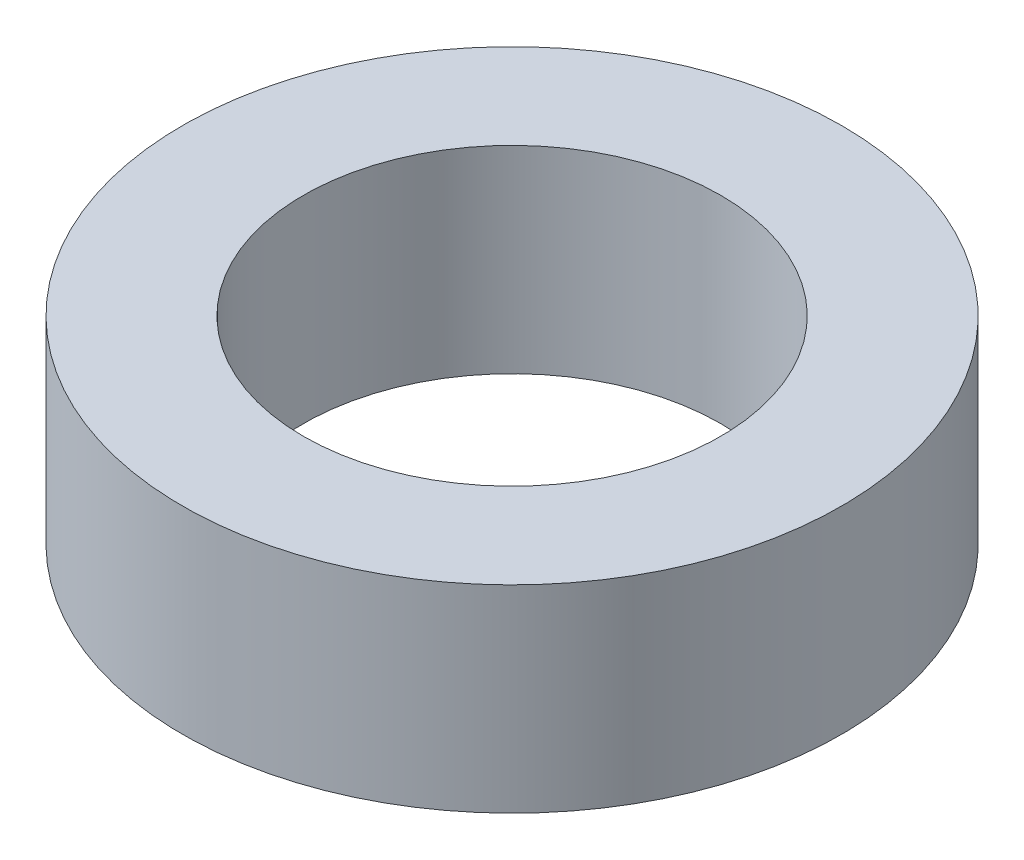
ISO-10303-21;
HEADER;
FILE_DESCRIPTION(('STEP AP214'),'2;1');
FILE_NAME('part.step','',(''),(''),'','','');
FILE_SCHEMA(('AUTOMOTIVE_DESIGN { 1 0 10303 214 1 1 1 1 }'));
ENDSEC;
DATA;
#1=APPLICATION_CONTEXT('core data for automotive mechanical design processes');
#2=APPLICATION_PROTOCOL_DEFINITION('international standard','automotive_design',2000,#1);
#3=PRODUCT_CONTEXT('',#1,'mechanical');
#4=PRODUCT('Part','Part','',(#3));
#5=PRODUCT_RELATED_PRODUCT_CATEGORY('part','',(#4));
#6=PRODUCT_DEFINITION_FORMATION('','',#4);
#7=PRODUCT_DEFINITION_CONTEXT('part definition',#1,'design');
#8=PRODUCT_DEFINITION('design','',#6,#7);
#9=PRODUCT_DEFINITION_SHAPE('','',#8);
#10=(LENGTH_UNIT() NAMED_UNIT(*) SI_UNIT(.MILLI.,.METRE.));
#11=(NAMED_UNIT(*) PLANE_ANGLE_UNIT() SI_UNIT($,.RADIAN.));
#12=(NAMED_UNIT(*) SI_UNIT($,.STERADIAN.) SOLID_ANGLE_UNIT());
#13=UNCERTAINTY_MEASURE_WITH_UNIT(LENGTH_MEASURE(1.E-05),#10,'distance_accuracy_value','');
#14=(GEOMETRIC_REPRESENTATION_CONTEXT(3) GLOBAL_UNCERTAINTY_ASSIGNED_CONTEXT((#13)) GLOBAL_UNIT_ASSIGNED_CONTEXT((#10,
#11,#12)) REPRESENTATION_CONTEXT('',''));
#15=CARTESIAN_POINT('',(0.,0.,0.));
#16=DIRECTION('',(0.,0.,1.));
#17=DIRECTION('',(1.,0.,0.));
#18=AXIS2_PLACEMENT_3D('',#15,#16,#17);
#19=CARTESIAN_POINT('',(0.,9.,0.));
#20=DIRECTION('',(0.,-1.,0.));
#21=DIRECTION('',(0.,0.,1.));
#22=AXIS2_PLACEMENT_3D('',#19,#20,#21);
#23=CYLINDRICAL_SURFACE('',#22,15.);
#24=CARTESIAN_POINT('',(0.,9.,0.));
#25=DIRECTION('',(0.,-1.,0.));
#26=DIRECTION('',(0.,0.,-1.));
#27=AXIS2_PLACEMENT_3D('',#24,#25,#26);
#28=CIRCLE('',#27,15.);
#29=CARTESIAN_POINT('',(0.,9.,-15.));
#30=VERTEX_POINT('',#29);
#31=EDGE_CURVE('E10',#30,#30,#28,.T.);
#32=ORIENTED_EDGE('',*,*,#31,.T.);
#33=EDGE_LOOP('',(#32));
#34=FACE_BOUND('',#33,.T.);
#35=CARTESIAN_POINT('',(0.,0.,0.));
#36=DIRECTION('',(0.,-1.,0.));
#37=DIRECTION('',(0.,0.,-1.));
#38=AXIS2_PLACEMENT_3D('',#35,#36,#37);
#39=CIRCLE('',#38,15.);
#40=CARTESIAN_POINT('',(0.,0.,-15.));
#41=VERTEX_POINT('',#40);
#42=EDGE_CURVE('E40',#41,#41,#39,.T.);
#43=ORIENTED_EDGE('',*,*,#42,.F.);
#44=EDGE_LOOP('',(#43));
#45=FACE_BOUND('',#44,.T.);
#46=ADVANCED_FACE('F37',(#34,#45),#23,.T.);
#47=CARTESIAN_POINT('',(0.,9.,0.));
#48=DIRECTION('',(0.,1.,0.));
#49=DIRECTION('',(0.,0.,-1.));
#50=AXIS2_PLACEMENT_3D('',#47,#48,#49);
#51=PLANE('',#50);
#52=CARTESIAN_POINT('',(0.,9.,0.));
#53=DIRECTION('',(0.,-1.,0.));
#54=DIRECTION('',(0.,0.,-1.));
#55=AXIS2_PLACEMENT_3D('',#52,#53,#54);
#56=CIRCLE('',#55,9.5);
#57=CARTESIAN_POINT('',(0.,9.,-9.5));
#58=VERTEX_POINT('',#57);
#59=EDGE_CURVE('E49',#58,#58,#56,.T.);
#60=ORIENTED_EDGE('',*,*,#59,.T.);
#61=EDGE_LOOP('',(#60));
#62=FACE_BOUND('',#61,.T.);
#63=ORIENTED_EDGE('',*,*,#31,.F.);
#64=EDGE_LOOP('',(#63));
#65=FACE_BOUND('',#64,.T.);
#66=ADVANCED_FACE('F61',(#62,#65),#51,.T.);
#67=CARTESIAN_POINT('',(0.,0.,0.));
#68=DIRECTION('',(0.,1.,0.));
#69=DIRECTION('',(0.,0.,-1.));
#70=AXIS2_PLACEMENT_3D('',#67,#68,#69);
#71=PLANE('',#70);
#72=CARTESIAN_POINT('',(0.,0.,0.));
#73=DIRECTION('',(0.,-1.,0.));
#74=DIRECTION('',(0.,0.,-1.));
#75=AXIS2_PLACEMENT_3D('',#72,#73,#74);
#76=CIRCLE('',#75,9.5);
#77=CARTESIAN_POINT('',(0.,0.,-9.5));
#78=VERTEX_POINT('',#77);
#79=EDGE_CURVE('E47',#78,#78,#76,.T.);
#80=ORIENTED_EDGE('',*,*,#79,.F.);
#81=EDGE_LOOP('',(#80));
#82=FACE_BOUND('',#81,.T.);
#83=ORIENTED_EDGE('',*,*,#42,.T.);
#84=EDGE_LOOP('',(#83));
#85=FACE_BOUND('',#84,.T.);
#86=ADVANCED_FACE('F58',(#82,#85),#71,.F.);
#87=CARTESIAN_POINT('',(0.,0.,0.));
#88=DIRECTION('',(0.,1.,0.));
#89=DIRECTION('',(0.,0.,-1.));
#90=AXIS2_PLACEMENT_3D('',#87,#88,#89);
#91=CYLINDRICAL_SURFACE('',#90,9.5);
#92=ORIENTED_EDGE('',*,*,#79,.T.);
#93=EDGE_LOOP('',(#92));
#94=FACE_BOUND('',#93,.T.);
#95=ORIENTED_EDGE('',*,*,#59,.F.);
#96=EDGE_LOOP('',(#95));
#97=FACE_BOUND('',#96,.T.);
#98=ADVANCED_FACE('F55',(#94,#97),#91,.F.);
#99=CLOSED_SHELL('',(#46,#66,#86,#98));
#100=MANIFOLD_SOLID_BREP('B2',#99);
#101=ADVANCED_BREP_SHAPE_REPRESENTATION('',(#18,#100),#14);
#102=SHAPE_DEFINITION_REPRESENTATION(#9,#101);
ENDSEC;
END-ISO-10303-21;
